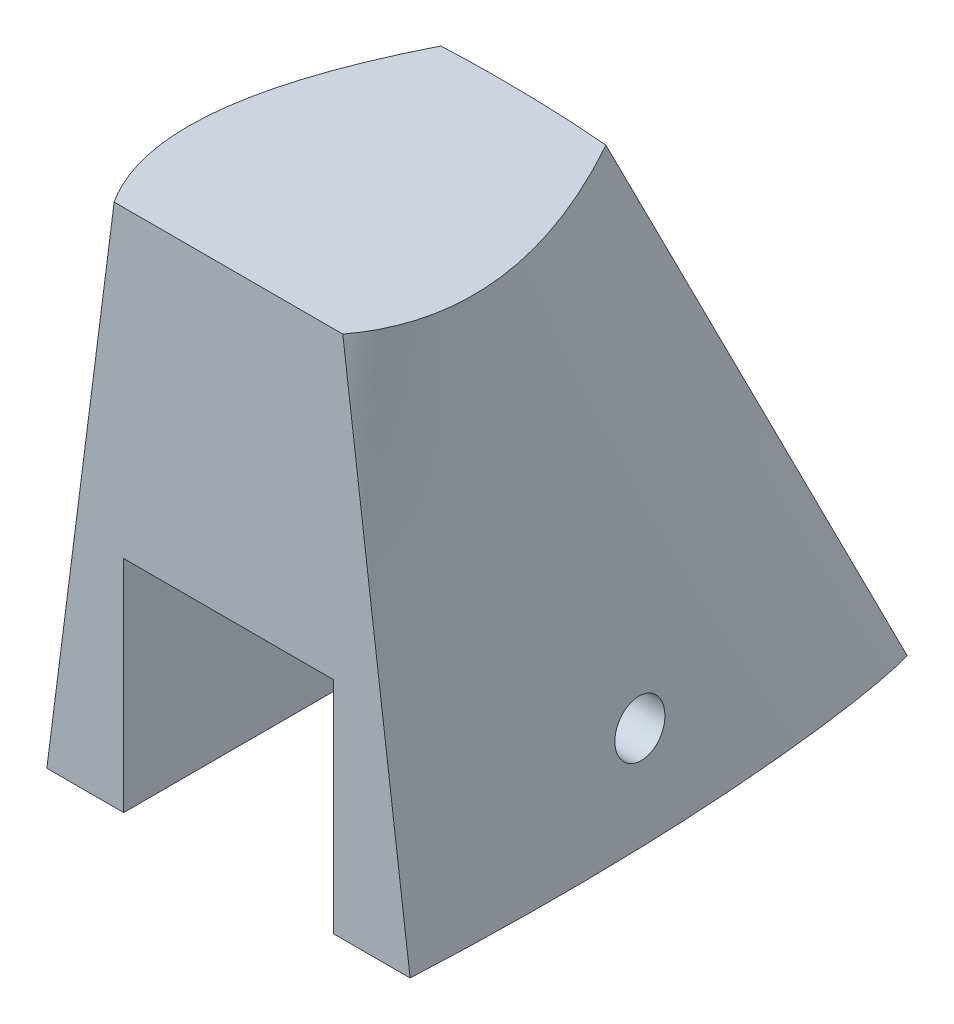
ISO-10303-21;
HEADER;
FILE_DESCRIPTION(('STEP AP214'),'2;1');
FILE_NAME('part.step','',(''),(''),'','','');
FILE_SCHEMA(('AUTOMOTIVE_DESIGN { 1 0 10303 214 1 1 1 1 }'));
ENDSEC;
DATA;
#1=APPLICATION_CONTEXT('core data for automotive mechanical design processes');
#2=APPLICATION_PROTOCOL_DEFINITION('international standard','automotive_design',2000,#1);
#3=PRODUCT_CONTEXT('',#1,'mechanical');
#4=PRODUCT('Part','Part','',(#3));
#5=PRODUCT_RELATED_PRODUCT_CATEGORY('part','',(#4));
#6=PRODUCT_DEFINITION_FORMATION('','',#4);
#7=PRODUCT_DEFINITION_CONTEXT('part definition',#1,'design');
#8=PRODUCT_DEFINITION('design','',#6,#7);
#9=PRODUCT_DEFINITION_SHAPE('','',#8);
#10=(LENGTH_UNIT() NAMED_UNIT(*) SI_UNIT(.MILLI.,.METRE.));
#11=(NAMED_UNIT(*) PLANE_ANGLE_UNIT() SI_UNIT($,.RADIAN.));
#12=(NAMED_UNIT(*) SI_UNIT($,.STERADIAN.) SOLID_ANGLE_UNIT());
#13=UNCERTAINTY_MEASURE_WITH_UNIT(LENGTH_MEASURE(1.E-05),#10,'distance_accuracy_value','');
#14=(GEOMETRIC_REPRESENTATION_CONTEXT(3) GLOBAL_UNCERTAINTY_ASSIGNED_CONTEXT((#13)) GLOBAL_UNIT_ASSIGNED_CONTEXT((#10,
#11,#12)) REPRESENTATION_CONTEXT('',''));
#15=CARTESIAN_POINT('',(0.,0.,0.));
#16=DIRECTION('',(0.,0.,1.));
#17=DIRECTION('',(1.,0.,0.));
#18=AXIS2_PLACEMENT_3D('',#15,#16,#17);
#19=CARTESIAN_POINT('',(6.47919218277337E-13,0.,-8.5150911907011));
#20=DIRECTION('',(0.,-1.,0.));
#21=DIRECTION('',(0.,0.,-1.));
#22=AXIS2_PLACEMENT_3D('',#19,#20,#21);
#23=PLANE('',#22);
#24=CARTESIAN_POINT('',(5.76096322759391,0.,-8.29632819805979));
#25=CARTESIAN_POINT('',(1.91974228306342,0.,-8.58801218824814));
#26=CARTESIAN_POINT('',(-1.91974228306213,0.,-8.58801218824821));
#27=CARTESIAN_POINT('',(-5.76096322759262,0.,-8.29632819805992));
#28=B_SPLINE_CURVE_WITH_KNOTS('',3,(#24,#25,#26,#27),.UNSPECIFIED.,.F.,.F.,(4,4),(0.,1.),.UNSPECIFIED.);
#29=CARTESIAN_POINT('',(-4.,0.,-8.40961910674386));
#30=VERTEX_POINT('',#29);
#31=CARTESIAN_POINT('',(-5.760963227599,0.,-8.29632819803115));
#32=VERTEX_POINT('',#31);
#33=EDGE_CURVE('E149',#30,#32,#28,.T.);
#34=ORIENTED_EDGE('',*,*,#33,.F.);
#35=DIRECTION('',(0.,0.,-1.));
#36=VECTOR('',#35,1.);
#37=CARTESIAN_POINT('',(-4.,0.,17.6214543016305));
#38=LINE('',#37,#36);
#39=CARTESIAN_POINT('',(-4.,0.,11.8461538461538));
#40=VERTEX_POINT('',#39);
#41=EDGE_CURVE('E200',#40,#30,#38,.T.);
#42=ORIENTED_EDGE('',*,*,#41,.F.);
#43=CARTESIAN_POINT('',(-8.75,0.,11.8461538461538));
#44=CARTESIAN_POINT('',(0.,0.,11.8461538461538));
#45=CARTESIAN_POINT('',(8.75,0.,11.8461538461538));
#46=B_SPLINE_CURVE_WITH_KNOTS('',2,(#43,#44,#45),.UNSPECIFIED.,.F.,.F.,(3,3),(0.,1.),.UNSPECIFIED.);
#47=CARTESIAN_POINT('',(-6.93238442967533,0.,11.8461538461538));
#48=VERTEX_POINT('',#47);
#49=EDGE_CURVE('E368',#48,#40,#46,.T.);
#50=ORIENTED_EDGE('',*,*,#49,.F.);
#51=CARTESIAN_POINT('',(-5.760963227599,0.,-8.29632819803115));
#52=CARTESIAN_POINT('',(-5.8067513331507,0.,-8.14627627748472));
#53=CARTESIAN_POINT('',(-5.85036434938431,0.,-7.98043940425513));
#54=CARTESIAN_POINT('',(-5.93440813531999,0.,-7.62940137284435));
#55=CARTESIAN_POINT('',(-5.97481704629437,0.,-7.44399749399642));
#56=CARTESIAN_POINT('',(-6.05293666720244,0.,-7.0594241417336));
#57=CARTESIAN_POINT('',(-6.09058507596302,0.,-6.86032047769378));
#58=CARTESIAN_POINT('',(-6.1620273038029,0.,-6.46034957242623));
#59=CARTESIAN_POINT('',(-6.19607325347414,0.,-6.25821084034677));
#60=CARTESIAN_POINT('',(-6.29404613224256,0.,-5.64700565943598));
#61=CARTESIAN_POINT('',(-6.35384978498306,0.,-5.23323118676896));
#62=CARTESIAN_POINT('',(-6.46476620725011,0.,-4.39764983523415));
#63=CARTESIAN_POINT('',(-6.51584025536789,0.,-3.97576874559321));
#64=CARTESIAN_POINT('',(-6.65762831111588,0.,-2.70126736461715));
#65=CARTESIAN_POINT('',(-6.73616120859031,0.,-1.84760811988885));
#66=CARTESIAN_POINT('',(-6.8669899876044,0.,-0.139756635521907));
#67=CARTESIAN_POINT('',(-6.91926675996085,0.,0.715475761900413));
#68=CARTESIAN_POINT('',(-7.04110628436952,0.,3.28431111618752));
#69=CARTESIAN_POINT('',(-7.07574383746952,0.,5.00262853971937));
#70=CARTESIAN_POINT('',(-7.06348531191426,0.,8.42854205599656));
#71=CARTESIAN_POINT('',(-7.01656336326314,0.,10.1384183782692));
#72=CARTESIAN_POINT('',(-6.93238442967542,0.,11.8461538461538));
#73=B_SPLINE_CURVE_WITH_KNOTS('',3,(#51,#52,#53,#54,#55,#56,#57,#58,#59,#60,#61,#62,#63,#64,#65,
#66,#67,#68,#69,#70,#71,#72),.UNSPECIFIED.,.F.,.F.,(4,2,2,2,2,2,2,2,2,2,4),(0.,0.03125,
0.0625000000000001,0.0937500000000001,0.125,0.1875,0.25,0.375,0.5,0.75,1.),.UNSPECIFIED.);
#74=EDGE_CURVE('E279',#32,#48,#73,.T.);
#75=ORIENTED_EDGE('',*,*,#74,.F.);
#76=EDGE_LOOP('',(#34,#42,#50,#75));
#77=FACE_BOUND('',#76,.T.);
#78=ADVANCED_FACE('F119',(#77),#23,.T.);
#79=CARTESIAN_POINT('',(4.36295557759068,20.,11.8461538461538));
#80=DIRECTION('',(0.,0.,1.));
#81=DIRECTION('',(-1.,0.,0.));
#82=AXIS2_PLACEMENT_3D('',#79,#80,#81);
#83=PLANE('',#82);
#84=ORIENTED_EDGE('',*,*,#49,.T.);
#85=DIRECTION('',(0.,1.,0.));
#86=VECTOR('',#85,1.);
#87=CARTESIAN_POINT('',(-4.,20.,11.8461538461538));
#88=LINE('',#87,#86);
#89=CARTESIAN_POINT('',(-4.,8.39916316297851,11.8461538381802));
#90=VERTEX_POINT('',#89);
#91=EDGE_CURVE('E199',#40,#90,#88,.T.);
#92=ORIENTED_EDGE('',*,*,#91,.T.);
#93=DIRECTION('',(1.,0.,0.));
#94=VECTOR('',#93,1.);
#95=CARTESIAN_POINT('',(-4.,8.39916315723639,11.8461538461538));
#96=LINE('',#95,#94);
#97=CARTESIAN_POINT('',(4.,8.39916316297851,11.8461538381802));
#98=VERTEX_POINT('',#97);
#99=EDGE_CURVE('E205',#98,#90,#96,.F.);
#100=ORIENTED_EDGE('',*,*,#99,.F.);
#101=DIRECTION('',(0.,1.,0.));
#102=VECTOR('',#101,1.);
#103=CARTESIAN_POINT('',(4.,20.,11.8461538461538));
#104=LINE('',#103,#102);
#105=CARTESIAN_POINT('',(4.,0.,11.8461538461538));
#106=VERTEX_POINT('',#105);
#107=EDGE_CURVE('E192',#106,#98,#104,.T.);
#108=ORIENTED_EDGE('',*,*,#107,.F.);
#109=CARTESIAN_POINT('',(6.93238442967326,0.,11.8461538461538));
#110=VERTEX_POINT('',#109);
#111=EDGE_CURVE('E393',#106,#110,#46,.T.);
#112=ORIENTED_EDGE('',*,*,#111,.T.);
#113=CARTESIAN_POINT('',(4.36295557759068,20.,11.8461538461538));
#114=CARTESIAN_POINT('',(5.21943186161821,13.3333333333333,11.8461538461538));
#115=CARTESIAN_POINT('',(6.07590814564573,6.66666666666667,11.8461538461538));
#116=CARTESIAN_POINT('',(6.93238442967325,0.,11.8461538461538));
#117=B_SPLINE_CURVE_WITH_KNOTS('',3,(#113,#114,#115,#116),.UNSPECIFIED.,.F.,.F.,(4,4),(0.,1.),.UNSPECIFIED.);
#118=CARTESIAN_POINT('',(4.36295557759068,20.,11.8461538461538));
#119=VERTEX_POINT('',#118);
#120=EDGE_CURVE('E340',#119,#110,#117,.T.);
#121=ORIENTED_EDGE('',*,*,#120,.F.);
#122=DIRECTION('',(1.,0.,0.));
#123=VECTOR('',#122,1.);
#124=CARTESIAN_POINT('',(-4.36295557759068,20.,11.8461538461538));
#125=LINE('',#124,#123);
#126=CARTESIAN_POINT('',(-4.36295557759068,20.,11.8461538461538));
#127=VERTEX_POINT('',#126);
#128=EDGE_CURVE('E503',#127,#119,#125,.T.);
#129=ORIENTED_EDGE('',*,*,#128,.F.);
#130=CARTESIAN_POINT('',(-4.36295557759068,20.,11.8461538461538));
#131=CARTESIAN_POINT('',(-5.21943186161893,13.3333333333333,11.8461538461538));
#132=CARTESIAN_POINT('',(-6.07590814564718,6.66666666666667,11.8461538461538));
#133=CARTESIAN_POINT('',(-6.93238442967542,0.,11.8461538461538));
#134=B_SPLINE_CURVE_WITH_KNOTS('',3,(#130,#131,#132,#133),.UNSPECIFIED.,.F.,.F.,(4,4),(0.,1.),.UNSPECIFIED.);
#135=EDGE_CURVE('E341',#127,#48,#134,.T.);
#136=ORIENTED_EDGE('',*,*,#135,.T.);
#137=EDGE_LOOP('',(#84,#92,#100,#108,#112,#121,#129,#136));
#138=FACE_BOUND('',#137,.T.);
#139=ADVANCED_FACE('F121',(#138),#83,.T.);
#140=CARTESIAN_POINT('',(-3.28790277497466,20.,0.454259940663015));
#141=CARTESIAN_POINT('',(-4.11225625918065,13.3333333333333,-2.46260277224463));
#142=CARTESIAN_POINT('',(-4.93660974338663,6.66666666666667,-5.37946548515228));
#143=CARTESIAN_POINT('',(-5.76096322759262,0.,-8.29632819805992));
#144=CARTESIAN_POINT('',(-2.75174644561783,20.,0.429746985763324));
#145=CARTESIAN_POINT('',(-3.43471696089855,13.3333333333333,-2.50325174136012));
#146=CARTESIAN_POINT('',(-4.11768747617927,6.66666666666667,-5.43625046848356));
#147=CARTESIAN_POINT('',(-4.80065799146,0.,-8.369249195607));
#148=CARTESIAN_POINT('',(-1.67977358058458,20.,0.398186471137266));
#149=CARTESIAN_POINT('',(-2.07993724255484,13.3333333333333,-2.56075258321769));
#150=CARTESIAN_POINT('',(-2.48010090452511,6.66666666666667,-5.51969163757264));
#151=CARTESIAN_POINT('',(-2.88026456649537,0.,-8.4786306919276));
#152=CARTESIAN_POINT('',(-0.0728336640759535,20.,0.40324188471864));
#153=CARTESIAN_POINT('',(-0.0485557760504196,13.3333333333333,-2.57561255688353));
#154=CARTESIAN_POINT('',(-0.0242778880248858,6.66666666666666,-5.55446699848569));
#155=CARTESIAN_POINT('',(6.48136058711835E-13,0.,-8.53332144008786));
#156=CARTESIAN_POINT('',(1.53308687139141,20.,0.460693483820966));
#157=CARTESIAN_POINT('',(1.98214610309316,13.3333333333333,-2.51908124142853));
#158=CARTESIAN_POINT('',(2.43120533479491,6.66666666666667,-5.49885596667802));
#159=CARTESIAN_POINT('',(2.88026456649666,0.,-8.47863069192752));
#160=CARTESIAN_POINT('',(2.60302097434213,20.,0.533925340236815));
#161=CARTESIAN_POINT('',(3.33556664671519,13.3333333333333,-2.43379950504442));
#162=CARTESIAN_POINT('',(4.06811231908824,6.66666666666667,-5.40152435032565));
#163=CARTESIAN_POINT('',(4.80065799146129,0.,-8.36924919560688));
#164=CARTESIAN_POINT('',(3.13781812897728,20.,0.579273966031729));
#165=CARTESIAN_POINT('',(4.0121998285163,13.3333333333333,-2.37926008866544));
#166=CARTESIAN_POINT('',(4.88658152805533,6.66666666666667,-5.33779414336261));
#167=CARTESIAN_POINT('',(5.76096322759435,0.,-8.29632819805978));
#168=B_SPLINE_SURFACE_WITH_KNOTS('',3,3,((#140,#141,#142,#143),(#144,#145,#146,#147),(#148,#149,
#150,#151),(#152,#153,#154,#155),(#156,#157,#158,#159),(#160,#161,#162,#163),(#164,#165,#166,
#167)),.UNSPECIFIED.,.F.,.F.,.F.,(4,1,1,1,4),(4,4),(0.306645599942551,0.349079262473725,
0.391512925004898,0.433946587536072,0.476380250067246),(0.,1.),.UNSPECIFIED.);
#169=CARTESIAN_POINT('',(-4.,10.0992114455502,-3.90879344125424));
#170=CARTESIAN_POINT('',(-3.51970618654818,10.0817341016703,-3.94382984918015));
#171=CARTESIAN_POINT('',(-3.0387585121383,10.0676883616501,-3.97179298295832));
#172=CARTESIAN_POINT('',(-2.07610995827582,10.0467059284975,-4.0134094818933));
#173=CARTESIAN_POINT('',(-1.5944091094109,10.0397689538099,-4.02706341379165));
#174=CARTESIAN_POINT('',(-0.686664484352067,10.0336266746966,-4.03915646651588));
#175=CARTESIAN_POINT('',(-0.260646587220647,10.0336178041258,-4.03917684959916));
#176=CARTESIAN_POINT('',(0.591198906910872,10.0393480453626,-4.02788924803106));
#177=CARTESIAN_POINT('',(1.01702650518624,10.0450871180549,-4.01658134046969));
#178=CARTESIAN_POINT('',(1.86961590153149,10.0622451949711,-3.98261149137385));
#179=CARTESIAN_POINT('',(2.29637570050429,10.0736841523071,-3.95990966204965));
#180=CARTESIAN_POINT('',(3.14897112183231,10.1019970435484,-3.90325230599396));
#181=CARTESIAN_POINT('',(3.57480673725412,10.1188710180873,-3.86929669512608));
#182=CARTESIAN_POINT('',(4.,10.1383350782267,-3.82977453338038));
#183=B_SPLINE_CURVE_WITH_KNOTS('',3,(#169,#170,#171,#172,#173,#174,#175,#176,#177,#178,#179,
#180,#181,#182),.UNSPECIFIED.,.F.,.F.,(4,2,2,2,2,2,4),(0.,1.44561838737642,2.89117951628545,
4.16904697704582,5.44690574186366,6.72926956269325,8.01164297104486),.UNSPECIFIED.);
#184=CARTESIAN_POINT('',(-4.,10.0992114455502,-3.90879344125426));
#185=VERTEX_POINT('',#184);
#186=CARTESIAN_POINT('',(4.,10.1383350782267,-3.82977453338038));
#187=VERTEX_POINT('',#186);
#188=EDGE_CURVE('E134',#185,#187,#183,.T.);
#189=CARTESIAN_POINT('',(-4.,11.870941103437,-3.12000276674606));
#190=CARTESIAN_POINT('',(-4.,10.9910942838933,-3.51163178627637));
#191=CARTESIAN_POINT('',(-4.,10.1112985835498,-3.90337561897401));
#192=CARTESIAN_POINT('',(-4.,8.35178631425786,-4.68704090131557));
#193=CARTESIAN_POINT('',(-4.,7.47206974530746,-5.07896235095525));
#194=CARTESIAN_POINT('',(-4.,5.49358004695059,-5.96056618828693));
#195=CARTESIAN_POINT('',(-4.,4.39482259825535,-6.45028376387649));
#196=CARTESIAN_POINT('',(-4.,2.19737040983152,-7.42985967906575));
#197=CARTESIAN_POINT('',(-4.,1.09867567010479,-7.91971801866963));
#198=CARTESIAN_POINT('',(-4.,0.,-8.40961910674386));
#199=B_SPLINE_CURVE_WITH_KNOTS('',3,(#189,#190,#191,#192,#193,#194,#195,#196,#197,#198),
.UNSPECIFIED.,.F.,.F.,(4,2,2,2,4),(0.,2.88920980121523,5.778419533721,9.3872726807394,
12.9961259349583),.UNSPECIFIED.);
#200=EDGE_CURVE('E13',#185,#30,#199,.T.);
#201=CARTESIAN_POINT('',(-3.28790277497466,20.,0.454259940663015));
#202=CARTESIAN_POINT('',(-4.11225625918065,13.3333333333333,-2.46260277224463));
#203=CARTESIAN_POINT('',(-4.93660974338663,6.66666666666667,-5.37946548515228));
#204=CARTESIAN_POINT('',(-5.76096322759262,0.,-8.29632819805992));
#205=B_SPLINE_CURVE_WITH_KNOTS('',3,(#201,#202,#203,#204),.UNSPECIFIED.,.F.,.F.,(4,4),(0.,1.),.UNSPECIFIED.);
#206=CARTESIAN_POINT('',(-3.28790277497466,20.,0.454259940663015));
#207=VERTEX_POINT('',#206);
#208=EDGE_CURVE('E312',#207,#32,#205,.T.);
#209=CARTESIAN_POINT('',(3.13781812897728,20.,0.579273966031729));
#210=CARTESIAN_POINT('',(0.998629510436692,20.,0.397879462852074));
#211=CARTESIAN_POINT('',(-1.14327745754734,20.,0.356208121064252));
#212=CARTESIAN_POINT('',(-3.28790277497466,20.,0.454259940663015));
#213=B_SPLINE_CURVE_WITH_KNOTS('',3,(#209,#210,#211,#212),.UNSPECIFIED.,.F.,.F.,(4,4),(0.,1.),.UNSPECIFIED.);
#214=CARTESIAN_POINT('',(3.13781812897728,20.,0.579273966031729));
#215=VERTEX_POINT('',#214);
#216=EDGE_CURVE('E213',#215,#207,#213,.T.);
#217=CARTESIAN_POINT('',(3.13781812897728,20.,0.579273966031729));
#218=CARTESIAN_POINT('',(4.0121998285163,13.3333333333333,-2.37926008866544));
#219=CARTESIAN_POINT('',(4.88658152805533,6.66666666666667,-5.33779414336261));
#220=CARTESIAN_POINT('',(5.76096322759435,0.,-8.29632819805978));
#221=B_SPLINE_CURVE_WITH_KNOTS('',3,(#217,#218,#219,#220),.UNSPECIFIED.,.F.,.F.,(4,4),(0.,1.),.UNSPECIFIED.);
#222=CARTESIAN_POINT('',(5.76096322759435,0.,-8.29632819805978));
#223=VERTEX_POINT('',#222);
#224=EDGE_CURVE('E233',#215,#223,#221,.T.);
#225=CARTESIAN_POINT('',(4.,0.,-8.40961910674382));
#226=VERTEX_POINT('',#225);
#227=EDGE_CURVE('E363',#223,#226,#28,.T.);
#228=CARTESIAN_POINT('',(4.,11.870941103437,-3.04419353905678));
#229=CARTESIAN_POINT('',(4.,10.9939219657173,-3.44211581826744));
#230=CARTESIAN_POINT('',(4.,10.1167411706128,-3.83968158151507));
#231=CARTESIAN_POINT('',(4.,8.36210500938562,-4.63420592503767));
#232=CARTESIAN_POINT('',(4.,7.48464964336292,-5.03116450553363));
#233=CARTESIAN_POINT('',(4.,5.50621414931116,-5.92552342423688));
#234=CARTESIAN_POINT('',(4.,4.40516906548183,-6.42278005097896));
#235=CARTESIAN_POINT('',(4.,2.20278704246485,-7.41664794016988));
#236=CARTESIAN_POINT('',(4.,1.10145010314414,-7.91325920232389));
#237=CARTESIAN_POINT('',(4.,0.,-8.40961910674382));
#238=B_SPLINE_CURVE_WITH_KNOTS('',3,(#228,#229,#230,#231,#232,#233,#234,#235,#236,#237),
.UNSPECIFIED.,.F.,.F.,(4,2,2,2,4),(0.,2.8892111625006,5.7784212732093,9.40279407733556,
13.0271685366118),.UNSPECIFIED.);
#239=EDGE_CURVE('E405',#187,#226,#238,.T.);
#240=ORIENTED_EDGE('',*,*,#188,.F.);
#241=ORIENTED_EDGE('',*,*,#200,.T.);
#242=ORIENTED_EDGE('',*,*,#33,.T.);
#243=ORIENTED_EDGE('',*,*,#208,.F.);
#244=ORIENTED_EDGE('',*,*,#216,.F.);
#245=ORIENTED_EDGE('',*,*,#224,.T.);
#246=ORIENTED_EDGE('',*,*,#227,.T.);
#247=ORIENTED_EDGE('',*,*,#239,.F.);
#248=EDGE_LOOP('',(#240,#241,#242,#243,#244,#245,#246,#247));
#249=FACE_BOUND('',#248,.T.);
#250=ADVANCED_FACE('F249',(#249),#168,.T.);
#251=DIRECTION('',(0.,0.,-1.));
#252=VECTOR('',#251,1.);
#253=CARTESIAN_POINT('',(4.,0.,17.6214543016305));
#254=LINE('',#253,#252);
#255=EDGE_CURVE('E195',#106,#226,#254,.T.);
#256=ORIENTED_EDGE('',*,*,#255,.T.);
#257=ORIENTED_EDGE('',*,*,#227,.F.);
#258=CARTESIAN_POINT('',(6.93238442967326,0.,11.8461538461538));
#259=CARTESIAN_POINT('',(7.01656336326121,0.,10.1384183782672));
#260=CARTESIAN_POINT('',(7.06348531191226,0.,8.42854205598782));
#261=CARTESIAN_POINT('',(7.07574383746749,0.,5.00262853970674));
#262=CARTESIAN_POINT('',(7.04110628436735,0.,3.2843111161729));
#263=CARTESIAN_POINT('',(6.91926675995834,0.,0.715475761882828));
#264=CARTESIAN_POINT('',(6.86698998760174,0.,-0.139756635540479));
#265=CARTESIAN_POINT('',(6.73616120858732,0.,-1.84760811990939));
#266=CARTESIAN_POINT('',(6.65762831111272,0.,-2.70126736463862));
#267=CARTESIAN_POINT('',(6.51584025536438,0.,-3.97576874561626));
#268=CARTESIAN_POINT('',(6.46476620724648,0.,-4.39764983525772));
#269=CARTESIAN_POINT('',(6.35384978497916,0.,-5.23323118679357));
#270=CARTESIAN_POINT('',(6.29404613223853,0.,-5.64700565946111));
#271=CARTESIAN_POINT('',(6.19607325346991,0.,-6.25821084037266));
#272=CARTESIAN_POINT('',(6.16202730379862,0.,-6.46034957245239));
#273=CARTESIAN_POINT('',(6.09058507595862,0.,-6.86032047772042));
#274=CARTESIAN_POINT('',(6.05293666719801,0.,-7.05942414176051));
#275=CARTESIAN_POINT('',(5.97481704628983,0.,-7.44399749402389));
#276=CARTESIAN_POINT('',(5.93440813531541,0.,-7.62940137287206));
#277=CARTESIAN_POINT('',(5.85036434937969,0.,-7.98043940428336));
#278=CARTESIAN_POINT('',(5.80675133314605,0.,-8.14627627751316));
#279=CARTESIAN_POINT('',(5.76096322759435,0.,-8.29632819805978));
#280=B_SPLINE_CURVE_WITH_KNOTS('',3,(#258,#259,#260,#261,#262,#263,#264,#265,#266,#267,#268,
#269,#270,#271,#272,#273,#274,#275,#276,#277,#278,#279),.UNSPECIFIED.,.F.,.F.,(4,2,2,2,2,2,2,2,
2,2,4),(0.,0.25,0.5,0.625,0.75,0.8125,0.875,0.90625,0.9375,0.96875,1.),.UNSPECIFIED.);
#281=EDGE_CURVE('E338',#110,#223,#280,.T.);
#282=ORIENTED_EDGE('',*,*,#281,.F.);
#283=ORIENTED_EDGE('',*,*,#111,.F.);
#284=EDGE_LOOP('',(#256,#257,#282,#283));
#285=FACE_BOUND('',#284,.T.);
#286=ADVANCED_FACE('F253',(#285),#23,.T.);
#287=CARTESIAN_POINT('',(-0.0730035609161646,20.,0.411974582305465));
#288=DIRECTION('',(0.,-1.,0.));
#289=DIRECTION('',(0.,0.,-1.));
#290=AXIS2_PLACEMENT_3D('',#287,#288,#289);
#291=PLANE('',#290);
#292=ORIENTED_EDGE('',*,*,#216,.T.);
#293=CARTESIAN_POINT('',(-3.28790277497466,20.,0.454259940663012));
#294=CARTESIAN_POINT('',(-6.99345477709558,20.,7.80002257925671));
#295=CARTESIAN_POINT('',(-4.36295557759068,20.,11.8461538461538));
#296=B_SPLINE_CURVE_WITH_KNOTS('',2,(#293,#294,#295),.UNSPECIFIED.,.F.,.F.,(3,3),(0.,1.),.UNSPECIFIED.);
#297=EDGE_CURVE('E216',#207,#127,#296,.T.);
#298=ORIENTED_EDGE('',*,*,#297,.T.);
#299=ORIENTED_EDGE('',*,*,#128,.T.);
#300=CARTESIAN_POINT('',(4.36295557759068,20.,11.8461538461538));
#301=CARTESIAN_POINT('',(7.2780963631191,20.,8.01198098265211));
#302=CARTESIAN_POINT('',(3.13781812897728,20.,0.579273966031729));
#303=B_SPLINE_CURVE_WITH_KNOTS('',2,(#300,#301,#302),.UNSPECIFIED.,.F.,.F.,(3,3),(0.,1.),.UNSPECIFIED.);
#304=EDGE_CURVE('E227',#119,#215,#303,.T.);
#305=ORIENTED_EDGE('',*,*,#304,.T.);
#306=EDGE_LOOP('',(#292,#298,#299,#305));
#307=FACE_BOUND('',#306,.T.);
#308=ADVANCED_FACE('F247',(#307),#291,.F.);
#309=CARTESIAN_POINT('',(3.13781812897728,20.,0.579273966031729));
#310=CARTESIAN_POINT('',(4.0121998285163,13.3333333333333,-2.37926008866544));
#311=CARTESIAN_POINT('',(4.88658152805533,6.66666666666667,-5.33779414336261));
#312=CARTESIAN_POINT('',(5.76096322759435,0.,-8.29632819805978));
#313=CARTESIAN_POINT('',(3.31032972206652,20.,0.888970091724244));
#314=CARTESIAN_POINT('',(4.1577329609436,13.3333333333333,-2.07276139117268));
#315=CARTESIAN_POINT('',(5.00513619982068,6.66666666666667,-5.03449287406961));
#316=CARTESIAN_POINT('',(5.85253943869776,0.,-7.99622435696654));
#317=CARTESIAN_POINT('',(3.63697942121462,20.,1.49899116041886));
#318=CARTESIAN_POINT('',(4.43139078472646,13.3333333333333,-1.42564386259212));
#319=CARTESIAN_POINT('',(5.2258021482383,6.66666666666667,-4.35027888560311));
#320=CARTESIAN_POINT('',(6.02021351175014,0.,-7.2749139086141));
#321=CARTESIAN_POINT('',(4.21678487138924,20.,2.68154856704645));
#322=CARTESIAN_POINT('',(4.91326528325782,13.3333333333333,-0.094417159499028));
#323=CARTESIAN_POINT('',(5.60974569512639,6.66666666666667,-2.87038288604451));
#324=CARTESIAN_POINT('',(6.30622610699497,0.,-5.64634861258998));
#325=CARTESIAN_POINT('',(4.80374053137958,20.,4.08946145515283));
#326=CARTESIAN_POINT('',(5.39489503357659,13.3333333333333,1.53564667839408));
#327=CARTESIAN_POINT('',(5.98604953577359,6.66666666666667,-1.01816809836467));
#328=CARTESIAN_POINT('',(6.5772040379706,0.,-3.57198287512342));
#329=CARTESIAN_POINT('',(5.2876054790033,20.,5.66650272859553));
#330=CARTESIAN_POINT('',(5.79699915020992,13.3333333333333,3.45244976487946));
#331=CARTESIAN_POINT('',(6.30639282141655,6.66666666666667,1.23839680116339));
#332=CARTESIAN_POINT('',(6.81578649262318,0.,-0.97565616255268));
#333=CARTESIAN_POINT('',(5.63878295001533,20.,7.61928550347252));
#334=CARTESIAN_POINT('',(6.09998480788522,13.3333333333333,5.87450937191445));
#335=CARTESIAN_POINT('',(6.56118666575512,6.66666666666666,4.12973324035639));
#336=CARTESIAN_POINT('',(7.02238852362502,0.,2.38495710879833));
#337=CARTESIAN_POINT('',(5.52655017786864,20.,9.77912849135638));
#338=CARTESIAN_POINT('',(6.05467567262428,13.3333333333333,8.76976978063207));
#339=CARTESIAN_POINT('',(6.58280116737992,6.66666666666667,7.76041106990777));
#340=CARTESIAN_POINT('',(7.11092666213556,0.,6.75105235918346));
#341=CARTESIAN_POINT('',(4.84881237517875,20.,11.2071250355702));
#342=CARTESIAN_POINT('',(5.57139603787291,13.3333333333333,10.8508894831359));
#343=CARTESIAN_POINT('',(6.29397970056706,6.66666666666667,10.4946539307015));
#344=CARTESIAN_POINT('',(7.01656336326121,0.,10.1384183782672));
#345=CARTESIAN_POINT('',(4.36295557759068,20.,11.8461538461538));
#346=CARTESIAN_POINT('',(5.21943186161821,13.3333333333333,11.8461538461538));
#347=CARTESIAN_POINT('',(6.07590814564573,6.66666666666667,11.8461538461538));
#348=CARTESIAN_POINT('',(6.93238442967325,0.,11.8461538461538));
#349=B_SPLINE_SURFACE_WITH_KNOTS('',3,3,((#309,#310,#311,#312),(#313,#314,#315,#316),(#317,#318,
#319,#320),(#321,#322,#323,#324),(#325,#326,#327,#328),(#329,#330,#331,#332),(#333,#334,#335,
#336),(#337,#338,#339,#340),(#341,#342,#343,#344),(#345,#346,#347,#348)),.UNSPECIFIED.,.F.,.F.,
.F.,(4,1,1,1,1,1,1,4),(4,4),(0.476380250067246,0.49555926374676,0.514738277426274,
0.553096304785302,0.59145433214433,0.629812359503359,0.706528414221415,0.783244468939472),(0.,
1.),.UNSPECIFIED.);
#350=CARTESIAN_POINT('',(6.75128008600133,3.64031282206491,3.84615384615384));
#351=CARTESIAN_POINT('',(6.75579484356591,3.58412274688209,3.84615004840401));
#352=CARTESIAN_POINT('',(6.76015990297487,3.52786272310507,3.8413959206186));
#353=CARTESIAN_POINT('',(6.76638792740604,3.4447036732845,3.82724155222992));
#354=CARTESIAN_POINT('',(6.76841217372899,3.41716750670594,3.82134532523406));
#355=CARTESIAN_POINT('',(6.77234309767159,3.36265504231469,3.80724650425701));
#356=CARTESIAN_POINT('',(6.77424966815762,3.33567926909026,3.79904184534167));
#357=CARTESIAN_POINT('',(6.77976373480945,3.25598292132238,3.7710606321062));
#358=CARTESIAN_POINT('',(6.78317308597671,3.20439318469004,3.74789971384358));
#359=CARTESIAN_POINT('',(6.78933980906946,3.10584220565595,3.69321979089075));
#360=CARTESIAN_POINT('',(6.79209718737824,3.05888091794105,3.6617008680377));
#361=CARTESIAN_POINT('',(6.79685007537952,2.97102425716432,3.59127922490496));
#362=CARTESIAN_POINT('',(6.7988476534047,2.93011260428687,3.5523969881818));
#363=CARTESIAN_POINT('',(6.80200027428539,2.85538785924376,3.4682934405223));
#364=CARTESIAN_POINT('',(6.80315530345292,2.82157488240882,3.42307202661456));
#365=CARTESIAN_POINT('',(6.80455008602721,2.76213423843281,3.32776027981843));
#366=CARTESIAN_POINT('',(6.80479326220439,2.73647629300712,3.27768887995984));
#367=CARTESIAN_POINT('',(6.80433001312344,2.69390652800279,3.17396161734099));
#368=CARTESIAN_POINT('',(6.80362360483153,2.67699455216747,3.12030581863942));
#369=CARTESIAN_POINT('',(6.80124961169903,2.65241615126314,3.01104659412753));
#370=CARTESIAN_POINT('',(6.79958387641266,2.64473202287857,2.95544710888985));
#371=CARTESIAN_POINT('',(6.79531133210103,2.63875372936074,2.8437822941205));
#372=CARTESIAN_POINT('',(6.79270452327518,2.64045956223784,2.78771696468754));
#373=CARTESIAN_POINT('',(6.78659821731193,2.65319998131709,2.67663081706657));
#374=CARTESIAN_POINT('',(6.7830975310959,2.6642470392683,2.62161149589964));
#375=CARTESIAN_POINT('',(6.77529170368512,2.69534823610251,2.51424105687278));
#376=CARTESIAN_POINT('',(6.77098654461566,2.71540257513377,2.46188999833236));
#377=CARTESIAN_POINT('',(6.76166938916141,2.76404041488498,2.36108397721751));
#378=CARTESIAN_POINT('',(6.75665425517577,2.79266244087169,2.31264789523908));
#379=CARTESIAN_POINT('',(6.74608245116755,2.85757357257371,2.22128608700086));
#380=CARTESIAN_POINT('',(6.74052576329508,2.89386293105439,2.17836054247939));
#381=CARTESIAN_POINT('',(6.72901305799409,2.97331288158043,2.09897023057829));
#382=CARTESIAN_POINT('',(6.72305487478275,3.0165128118093,2.06254514214237));
#383=CARTESIAN_POINT('',(6.71096887844273,3.1084046885733,1.99748233938981));
#384=CARTESIAN_POINT('',(6.70484106039213,3.15709679458837,1.96884485128929));
#385=CARTESIAN_POINT('',(6.69260408146824,3.25881585891764,1.92005731351614));
#386=CARTESIAN_POINT('',(6.68649510171215,3.31185986358845,1.89994274765575));
#387=CARTESIAN_POINT('',(6.67454210755163,3.42061025406853,1.86894987795488));
#388=CARTESIAN_POINT('',(6.66869809452494,3.47631665371849,1.85807162213564));
#389=CARTESIAN_POINT('',(6.65749193684744,3.5887935611121,1.84588170027968));
#390=CARTESIAN_POINT('',(6.65212960748861,3.64556365078973,1.84456635161884));
#391=CARTESIAN_POINT('',(6.64208143483812,3.75856939808505,1.85155850312464));
#392=CARTESIAN_POINT('',(6.63739557440441,3.81480506921142,1.85986575940172));
#393=CARTESIAN_POINT('',(6.6288897678923,3.9248401001238,1.88582919323849));
#394=CARTESIAN_POINT('',(6.62506553661927,3.97865040170742,1.90343758002873));
#395=CARTESIAN_POINT('',(6.61837868091726,4.08258383682965,1.94749828063689));
#396=CARTESIAN_POINT('',(6.61551601820384,4.13270711710337,1.97395024226793));
#397=CARTESIAN_POINT('',(6.61084671113181,4.22748747959058,2.0347508989871));
#398=CARTESIAN_POINT('',(6.60903309865988,4.27217903561042,2.06904532584845));
#399=CARTESIAN_POINT('',(6.60645949004097,4.35519563961378,2.14465929353606));
#400=CARTESIAN_POINT('',(6.60569946576727,4.39352085752978,2.18597864679098));
#401=CARTESIAN_POINT('',(6.60521281677956,4.46255745544783,2.27427833989445));
#402=CARTESIAN_POINT('',(6.60548191496333,4.49329978406963,2.32123446576911));
#403=CARTESIAN_POINT('',(6.60698111729979,4.54650614939489,2.41960871873165));
#404=CARTESIAN_POINT('',(6.60821121881515,4.56897020881665,2.47102683357389));
#405=CARTESIAN_POINT('',(6.61153824906541,4.60500039359238,2.57688589485979));
#406=CARTESIAN_POINT('',(6.61363550921784,4.61856311182853,2.63132799013804));
#407=CARTESIAN_POINT('',(6.61858161546034,4.63640973972928,2.74167873986844));
#408=CARTESIAN_POINT('',(6.62143047542776,4.64069347805583,2.79758742138208));
#409=CARTESIAN_POINT('',(6.62776727554527,4.63987755527636,2.90950134985907));
#410=CARTESIAN_POINT('',(6.63125747629195,4.63474410667235,2.96550622144849));
#411=CARTESIAN_POINT('',(6.63874564903928,4.61518987424358,3.07583538707687));
#412=CARTESIAN_POINT('',(6.6427436330018,4.60076887159914,3.130159641488));
#413=CARTESIAN_POINT('',(6.6511480255056,4.56298048970289,3.23582833292131));
#414=CARTESIAN_POINT('',(6.65555608537272,4.53957563777269,3.28715923712074));
#415=CARTESIAN_POINT('',(6.66465844541719,4.48449651025549,3.38514554093237));
#416=CARTESIAN_POINT('',(6.6693527394024,4.45282241350997,3.43180104163074));
#417=CARTESIAN_POINT('',(6.67894440655519,4.38200353066355,3.51926058585975));
#418=CARTESIAN_POINT('',(6.68384237181601,4.34283556921242,3.56004577073065));
#419=CARTESIAN_POINT('',(6.69373948709455,4.25817802288357,3.63445221142791));
#420=CARTESIAN_POINT('',(6.69873863640909,4.21268848192493,3.66807351702109));
#421=CARTESIAN_POINT('',(6.70624655971548,4.14068738270085,3.71242524623856));
#422=CARTESIAN_POINT('',(6.70875517045011,4.11601231329418,3.7262147211323));
#423=CARTESIAN_POINT('',(6.71376116828024,4.06560880869628,3.75164810860325));
#424=CARTESIAN_POINT('',(6.71625856333229,4.03988132318898,3.76329390558525));
#425=CARTESIAN_POINT('',(6.72371678922154,3.96138975706741,3.79487943695009));
#426=CARTESIAN_POINT('',(6.72865190541284,3.907237053678,3.8115161927579));
#427=CARTESIAN_POINT('',(6.73654697008608,3.8173492474687,3.83100346348237));
#428=CARTESIAN_POINT('',(6.73956353471743,3.78219477249319,3.83667605005723));
#429=CARTESIAN_POINT('',(6.74550011855967,3.71147382884311,3.84425244531591));
#430=CARTESIAN_POINT('',(6.74842013771682,3.67590735993919,3.84615625190164));
#431=CARTESIAN_POINT('',(6.75128008600133,3.64031282206491,3.84615384615384));
#432=B_SPLINE_CURVE_WITH_KNOTS('',3,(#350,#351,#352,#353,#354,#355,#356,#357,#358,#359,#360,
#361,#362,#363,#364,#365,#366,#367,#368,#369,#370,#371,#372,#373,#374,#375,#376,#377,#378,#379,
#380,#381,#382,#383,#384,#385,#386,#387,#388,#389,#390,#391,#392,#393,#394,#395,#396,#397,#398,
#399,#400,#401,#402,#403,#404,#405,#406,#407,#408,#409,#410,#411,#412,#413,#414,#415,#416,#417,
#418,#419,#420,#421,#422,#423,#424,#425,#426,#427,#428,#429,#430,#431),.UNSPECIFIED.,.T.,.F.,(4,
2,2,2,2,2,2,2,2,2,2,2,2,2,2,2,2,2,2,2,2,2,2,2,2,2,2,2,2,2,2,2,2,2,2,2,2,2,2,2,4),(0.,
0.168961462401192,0.253578398889871,0.338271268730431,0.507355320822666,0.676437717394656,
0.845056485404874,1.01367799271755,1.18166591784886,1.34965084158168,1.5173129743878,
1.6849750716682,1.85286137372375,2.02075140651825,2.18940800940097,2.35807017317476,
2.52772904424231,2.69739284307568,2.86775622976252,3.03812050219391,3.20841916478352,
3.37871351116579,3.54814124824231,3.71756223882552,3.88584456330242,4.05412239520758,
4.22170161465999,4.38928037421664,4.55692323963028,4.72456920057349,4.89281782762399,
5.0610704188458,5.23003257429993,5.39899107586086,5.56848079672924,5.73796934012954,
5.82301439185195,5.90798432374559,6.07764654543141,6.18467793496208,6.29170938407768),.UNSPECIFIED.);
#433=CARTESIAN_POINT('',(6.75128008600133,3.64031282206491,3.84615384615384));
#434=VERTEX_POINT('',#433);
#435=EDGE_CURVE('E371',#434,#434,#432,.T.);
#436=ORIENTED_EDGE('',*,*,#435,.F.);
#437=EDGE_LOOP('',(#436));
#438=FACE_BOUND('',#437,.T.);
#439=ORIENTED_EDGE('',*,*,#304,.F.);
#440=ORIENTED_EDGE('',*,*,#120,.T.);
#441=ORIENTED_EDGE('',*,*,#281,.T.);
#442=ORIENTED_EDGE('',*,*,#224,.F.);
#443=EDGE_LOOP('',(#439,#440,#441,#442));
#444=FACE_BOUND('',#443,.T.);
#445=ADVANCED_FACE('F235',(#438,#444),#349,.T.);
#446=CARTESIAN_POINT('',(-4.36295557759068,20.,11.8461538461538));
#447=CARTESIAN_POINT('',(-5.21943186161893,13.3333333333333,11.8461538461538));
#448=CARTESIAN_POINT('',(-6.07590814564718,6.66666666666667,11.8461538461538));
#449=CARTESIAN_POINT('',(-6.93238442967542,0.,11.8461538461538));
#450=CARTESIAN_POINT('',(-4.8013721108415,20.,11.1717986350043));
#451=CARTESIAN_POINT('',(-5.53976919498205,13.3333333333333,10.827338549426));
#452=CARTESIAN_POINT('',(-6.27816627912259,6.66666666666667,10.4828784638476));
#453=CARTESIAN_POINT('',(-7.01656336326314,0.,10.1384183782692));
#454=CARTESIAN_POINT('',(-5.41420304394205,20.,9.68560357221792));
#455=CARTESIAN_POINT('',(-5.97975730346101,13.3333333333333,8.70635500618382));
#456=CARTESIAN_POINT('',(-6.54531156297997,6.66666666666667,7.72710644014972));
#457=CARTESIAN_POINT('',(-7.11086582249893,0.,6.74785787411562));
#458=CARTESIAN_POINT('',(-5.52023637681506,20.,7.48414814251653));
#459=CARTESIAN_POINT('',(-6.02100634348084,13.3333333333333,5.78617040436131));
#460=CARTESIAN_POINT('',(-6.52177631014662,6.66666666666667,4.08819266620609));
#461=CARTESIAN_POINT('',(-7.02254627681241,0.,2.39021492805086));
#462=CARTESIAN_POINT('',(-5.20905984301185,20.,5.51675683802438));
#463=CARTESIAN_POINT('',(-5.7446489963886,13.3333333333333,3.35249670869222));
#464=CARTESIAN_POINT('',(-6.28023814976535,6.66666666666667,1.18823657936007));
#465=CARTESIAN_POINT('',(-6.8158273031421,0.,-0.976023549972076));
#466=CARTESIAN_POINT('',(-4.77767584260864,20.,3.93809987928974));
#467=CARTESIAN_POINT('',(-5.37752079117336,13.3333333333333,1.43483532931488));
#468=CARTESIAN_POINT('',(-5.97736573973808,6.66666666666667,-1.06842922065998));
#469=CARTESIAN_POINT('',(-6.5772106883028,0.,-3.57169377063484));
#470=CARTESIAN_POINT('',(-4.25318784223029,20.,2.53662451337295));
#471=CARTESIAN_POINT('',(-4.93751121650399,13.3333333333333,-0.191216914733425));
#472=CARTESIAN_POINT('',(-5.62183459077769,6.66666666666667,-2.9190583428398));
#473=CARTESIAN_POINT('',(-6.30615796505139,0.,-5.64689977094618));
#474=CARTESIAN_POINT('',(-3.73459664190221,20.,1.36388748045676));
#475=CARTESIAN_POINT('',(-4.49646607396131,13.3333333333333,-1.51570923703047));
#476=CARTESIAN_POINT('',(-5.25833550602041,6.66666666666667,-4.3953059545177));
#477=CARTESIAN_POINT('',(-6.02020493807951,0.,-7.27490267200494));
#478=CARTESIAN_POINT('',(-3.44230077506303,20.,0.760333383937749));
#479=CARTESIAN_POINT('',(-4.24571366294282,13.3333333333333,-2.15851919635426));
#480=CARTESIAN_POINT('',(-5.04912655082261,6.66666666666667,-5.07737177664628));
#481=CARTESIAN_POINT('',(-5.8525394387024,0.,-7.99622435693829));
#482=CARTESIAN_POINT('',(-3.28790277497466,20.,0.454259940663015));
#483=CARTESIAN_POINT('',(-4.11225625918065,13.3333333333333,-2.46260277224463));
#484=CARTESIAN_POINT('',(-4.93660974338663,6.66666666666667,-5.37946548515228));
#485=CARTESIAN_POINT('',(-5.76096322759262,0.,-8.29632819805992));
#486=B_SPLINE_SURFACE_WITH_KNOTS('',3,3,((#446,#447,#448,#449),(#450,#451,#452,#453),(#454,#455,
#456,#457),(#458,#459,#460,#461),(#462,#463,#464,#465),(#466,#467,#468,#469),(#470,#471,#472,
#473),(#474,#475,#476,#477),(#478,#479,#480,#481),(#482,#483,#484,#485)),.UNSPECIFIED.,.F.,.F.,
.F.,(4,1,1,1,1,1,1,4),(4,4),(0.,0.0766613999856378,0.153322799971276,0.191653499964094,
0.229984199956913,0.268314899949732,0.287480249946142,0.306645599942551),(0.,1.),.UNSPECIFIED.);
#487=CARTESIAN_POINT('',(-6.63651727682798,3.64031282206491,1.84615384615385));
#488=CARTESIAN_POINT('',(-6.64197351755772,3.58379206991568,1.84615769449673));
#489=CARTESIAN_POINT('',(-6.64772929554698,3.52723922008106,1.85096806063057));
#490=CARTESIAN_POINT('',(-6.65664383245914,3.44371127947036,1.86526069190462));
#491=CARTESIAN_POINT('',(-6.65966487929687,3.41606227436556,1.87121259910071));
#492=CARTESIAN_POINT('',(-6.66577830825535,3.36134725229472,1.885436668025));
#493=CARTESIAN_POINT('',(-6.66887075076992,3.33428176937046,1.89371086550834));
#494=CARTESIAN_POINT('',(-6.67820141595645,3.25436512478682,1.92190982140051));
#495=CARTESIAN_POINT('',(-6.68450552942545,3.20267665530099,1.94523111735118));
#496=CARTESIAN_POINT('',(-6.69705368260955,3.10399274334136,2.00024823993747));
#497=CARTESIAN_POINT('',(-6.70329772124011,3.05699738545085,2.0319442174713));
#498=CARTESIAN_POINT('',(-6.71552411771691,2.96893519359925,2.10288303726596));
#499=CARTESIAN_POINT('',(-6.72150609398823,2.92787681643865,2.14213646269771));
#500=CARTESIAN_POINT('',(-6.73299871931448,2.85295755629219,2.2270589357083));
#501=CARTESIAN_POINT('',(-6.73850935324099,2.81909690427604,2.27272818908827));
#502=CARTESIAN_POINT('',(-6.74886754854559,2.75965210047798,2.36904824046786));
#503=CARTESIAN_POINT('',(-6.75371702974546,2.73404367763698,2.41968384789374));
#504=CARTESIAN_POINT('',(-6.76262538888503,2.6917291042967,2.52461257470026));
#505=CARTESIAN_POINT('',(-6.76668429394424,2.6750226483949,2.57890556853383));
#506=CARTESIAN_POINT('',(-6.77387598662062,2.65109498855897,2.68925761349262));
#507=CARTESIAN_POINT('',(-6.77701421487421,2.64381715650021,2.74530403084474));
#508=CARTESIAN_POINT('',(-6.7823205181019,2.63879577380526,2.85786783579966));
#509=CARTESIAN_POINT('',(-6.78448862774695,2.64105188240669,2.91438520649757));
#510=CARTESIAN_POINT('',(-6.78780504837839,2.6550120186675,3.02594423635492));
#511=CARTESIAN_POINT('',(-6.78895908163395,2.66666231163241,3.08099245396982));
#512=CARTESIAN_POINT('',(-6.79026417738871,2.69902042558014,3.18837126963152));
#513=CARTESIAN_POINT('',(-6.79041525778556,2.71972808492759,3.24070191615674));
#514=CARTESIAN_POINT('',(-6.78974470154032,2.76954480437591,3.34101868864473));
#515=CARTESIAN_POINT('',(-6.78892562335532,2.79863161455969,3.3890158839905));
#516=CARTESIAN_POINT('',(-6.78637777537903,2.86439716318567,3.47946372511473));
#517=CARTESIAN_POINT('',(-6.78464900422601,2.9010759129923,3.52191436259036));
#518=CARTESIAN_POINT('',(-6.78036281402375,2.98102436384802,3.60012295492531));
#519=CARTESIAN_POINT('',(-6.77780445045609,3.02430154753518,3.63587320761504));
#520=CARTESIAN_POINT('',(-6.7719623496699,3.11618437292588,3.69962692945321));
#521=CARTESIAN_POINT('',(-6.76867859946255,3.16479011003506,3.72763025986442));
#522=CARTESIAN_POINT('',(-6.76148742187282,3.26614570670724,3.77520974112828));
#523=CARTESIAN_POINT('',(-6.75757769964181,3.31891043732461,3.79475386400657));
#524=CARTESIAN_POINT('',(-6.7492661539056,3.42693054314047,3.82472931681217));
#525=CARTESIAN_POINT('',(-6.74486431918651,3.48218597507812,3.83516043903132));
#526=CARTESIAN_POINT('',(-6.73567173197009,3.5938741190058,3.84665799549682));
#527=CARTESIAN_POINT('',(-6.73087938085054,3.65031088693547,3.8476837622083));
#528=CARTESIAN_POINT('',(-6.72104282981628,3.76253380988712,3.84024867491256));
#529=CARTESIAN_POINT('',(-6.71599862527206,3.81831995292625,3.8317876464606));
#530=CARTESIAN_POINT('',(-6.70575539723138,3.92784323439335,3.80558426772891));
#531=CARTESIAN_POINT('',(-6.70055593203366,3.98157328529349,3.78781245938327));
#532=CARTESIAN_POINT('',(-6.69012420056625,4.08527205741706,3.74347826317921));
#533=CARTESIAN_POINT('',(-6.68489193398534,4.13524074289375,3.71691579179025));
#534=CARTESIAN_POINT('',(-6.67448786948703,4.23006071879182,3.65571281516696));
#535=CARTESIAN_POINT('',(-6.66931616061605,4.27490515933722,3.62106168123679));
#536=CARTESIAN_POINT('',(-6.65913758402378,4.35811963978778,3.54468298819897));
#537=CARTESIAN_POINT('',(-6.65413071653209,4.39648967067558,3.50295541923566));
#538=CARTESIAN_POINT('',(-6.64438244979981,4.4656370924132,3.41362928892084));
#539=CARTESIAN_POINT('',(-6.63964091889684,4.49641827521041,3.36603367758306));
#540=CARTESIAN_POINT('',(-6.63052348000391,4.54952363857944,3.26630511425003));
#541=CARTESIAN_POINT('',(-6.62614756899926,4.57184788888738,3.21417219967389));
#542=CARTESIAN_POINT('',(-6.61788025863943,4.60734891607528,3.10696580467502));
#543=CARTESIAN_POINT('',(-6.61398785565953,4.62054491002503,3.05189876628543));
#544=CARTESIAN_POINT('',(-6.60679342117403,4.63747071057373,2.94029037087177));
#545=CARTESIAN_POINT('',(-6.60349138092751,4.6412006573379,2.88374903569037));
#546=CARTESIAN_POINT('',(-6.59760845428033,4.63907248191728,2.77100956244836));
#547=CARTESIAN_POINT('',(-6.59502506139385,4.6332481859815,2.71481091761548));
#548=CARTESIAN_POINT('',(-6.59068002117427,4.61222387257586,2.60416238339621));
#549=CARTESIAN_POINT('',(-6.5889183549304,4.59702407088736,2.54971245379273));
#550=CARTESIAN_POINT('',(-6.58632601552022,4.55775637123385,2.44435183666276));
#551=CARTESIAN_POINT('',(-6.58549140644047,4.53372654540035,2.39342705387965));
#552=CARTESIAN_POINT('',(-6.58481942940599,4.47746938348902,2.29632067033548));
#553=CARTESIAN_POINT('',(-6.58498199798514,4.44524256923983,2.25013876790044));
#554=CARTESIAN_POINT('',(-6.58634734300557,4.37363868976135,2.16397892145961));
#555=CARTESIAN_POINT('',(-6.58754677201913,4.33428495614391,2.1239815006832));
#556=CARTESIAN_POINT('',(-6.59098746116466,4.24945300371151,2.05112538333576));
#557=CARTESIAN_POINT('',(-6.59322871279083,4.20397483490069,2.01826662848544));
#558=CARTESIAN_POINT('',(-6.59733709588696,4.13217969353301,1.9750326295784));
#559=CARTESIAN_POINT('',(-6.59883297075112,4.10762354447182,1.96161924964547));
#560=CARTESIAN_POINT('',(-6.60206232224295,4.05751226695792,1.93690981531332));
#561=CARTESIAN_POINT('',(-6.60379558776315,4.03195804035232,1.92561190056448));
#562=CARTESIAN_POINT('',(-6.60933449391339,3.95406604134214,1.89501724806299));
#563=CARTESIAN_POINT('',(-6.61348374641258,3.90042034574004,1.87897239054842));
#564=CARTESIAN_POINT('',(-6.62082906448075,3.81209188119379,1.86041032609798));
#565=CARTESIAN_POINT('',(-6.62378860365517,3.77794552936218,1.85506974133404));
#566=CARTESIAN_POINT('',(-6.62996731272072,3.70930771277814,1.84794032725301));
#567=CARTESIAN_POINT('',(-6.63318648253689,3.67481624812537,1.84615149691028));
#568=CARTESIAN_POINT('',(-6.63651727682798,3.64031282206491,1.84615384615385));
#569=B_SPLINE_CURVE_WITH_KNOTS('',3,(#487,#488,#489,#490,#491,#492,#493,#494,#495,#496,#497,
#498,#499,#500,#501,#502,#503,#504,#505,#506,#507,#508,#509,#510,#511,#512,#513,#514,#515,#516,
#517,#518,#519,#520,#521,#522,#523,#524,#525,#526,#527,#528,#529,#530,#531,#532,#533,#534,#535,
#536,#537,#538,#539,#540,#541,#542,#543,#544,#545,#546,#547,#548,#549,#550,#551,#552,#553,#554,
#555,#556,#557,#558,#559,#560,#561,#562,#563,#564,#565,#566,#567,#568),.UNSPECIFIED.,.T.,.F.,(4,
2,2,2,2,2,2,2,2,2,2,2,2,2,2,2,2,2,2,2,2,2,2,2,2,2,2,2,2,2,2,2,2,2,2,2,2,2,2,2,4),(0.,
0.170201311645723,0.255448913724927,0.340771479820396,0.511062689605543,0.681356967971823,
0.851891477877818,1.02243145928485,1.19246517907375,1.36249306508808,1.53149495920831,
1.70049081290881,1.86852681071194,2.03655980991112,2.20415066512635,2.37174177121162,
2.53952435923463,2.70730995182958,2.87572536695614,3.04414462059262,3.2132917555842,
3.38244200093182,3.55213067609878,3.72182096372594,3.89173549625922,4.06165026544197,
4.23147995983103,4.40130825376851,4.57077792317059,4.74024508319444,4.90911354837177,
5.07797812711281,5.24612300114958,5.41425717359,5.58185055583137,5.74944256980716,
5.83341798645931,5.9173192043077,6.0848495932087,6.1887500164034,6.29265040959448),.UNSPECIFIED.);
#570=CARTESIAN_POINT('',(-6.63651727682798,3.64031282206491,1.84615384615385));
#571=VERTEX_POINT('',#570);
#572=EDGE_CURVE('E124',#571,#571,#569,.T.);
#573=ORIENTED_EDGE('',*,*,#572,.F.);
#574=EDGE_LOOP('',(#573));
#575=FACE_BOUND('',#574,.T.);
#576=ORIENTED_EDGE('',*,*,#297,.F.);
#577=ORIENTED_EDGE('',*,*,#208,.T.);
#578=ORIENTED_EDGE('',*,*,#74,.T.);
#579=ORIENTED_EDGE('',*,*,#135,.F.);
#580=EDGE_LOOP('',(#576,#577,#578,#579));
#581=FACE_BOUND('',#580,.T.);
#582=ADVANCED_FACE('F246',(#575,#581),#486,.T.);
#583=CARTESIAN_POINT('',(-4.,2.92574029488755,-12.5859435548409));
#584=CARTESIAN_POINT('',(-4.,20.5173325316538,2.6649299469343));
#585=CARTESIAN_POINT('',(-4.,2.92574029488754,17.6214543016305));
#586=B_SPLINE_CURVE_WITH_KNOTS('',2,(#583,#584,#585),.UNSPECIFIED.,.F.,.F.,(3,3),(0.,1.),.UNSPECIFIED.);
#587=DIRECTION('',(1.,0.,0.));
#588=VECTOR('',#587,1.);
#589=SURFACE_OF_LINEAR_EXTRUSION('',#586,#588);
#590=ORIENTED_EDGE('',*,*,#99,.T.);
#591=EDGE_CURVE('E466',#185,#90,#586,.T.);
#592=ORIENTED_EDGE('',*,*,#591,.F.);
#593=ORIENTED_EDGE('',*,*,#188,.T.);
#594=CARTESIAN_POINT('',(4.,2.92574029488755,-12.5859435548409));
#595=CARTESIAN_POINT('',(4.,20.5173325316538,2.6649299469343));
#596=CARTESIAN_POINT('',(4.,2.92574029488754,17.6214543016305));
#597=B_SPLINE_CURVE_WITH_KNOTS('',2,(#594,#595,#596),.UNSPECIFIED.,.F.,.F.,(3,3),(0.,1.),.UNSPECIFIED.);
#598=EDGE_CURVE('E142',#187,#98,#597,.T.);
#599=ORIENTED_EDGE('',*,*,#598,.T.);
#600=EDGE_LOOP('',(#590,#592,#593,#599));
#601=FACE_BOUND('',#600,.T.);
#602=ADVANCED_FACE('F203',(#601),#589,.F.);
#603=CARTESIAN_POINT('',(-4.,11.7215364132707,2.59134266016455));
#604=DIRECTION('',(1.,0.,0.));
#605=DIRECTION('',(0.,0.,-1.));
#606=AXIS2_PLACEMENT_3D('',#603,#604,#605);
#607=PLANE('',#606);
#608=CARTESIAN_POINT('',(-4.,3.64031282206491,2.84615384615385));
#609=DIRECTION('',(1.,0.,0.));
#610=DIRECTION('',(0.,0.,-1.));
#611=AXIS2_PLACEMENT_3D('',#608,#609,#610);
#612=CIRCLE('',#611,0.999999999999993);
#613=CARTESIAN_POINT('',(-4.,3.64031282206491,1.84615384615385));
#614=VERTEX_POINT('',#613);
#615=EDGE_CURVE('E685',#614,#614,#612,.T.);
#616=ORIENTED_EDGE('',*,*,#615,.F.);
#617=EDGE_LOOP('',(#616));
#618=FACE_BOUND('',#617,.T.);
#619=ORIENTED_EDGE('',*,*,#41,.T.);
#620=ORIENTED_EDGE('',*,*,#200,.F.);
#621=ORIENTED_EDGE('',*,*,#591,.T.);
#622=ORIENTED_EDGE('',*,*,#91,.F.);
#623=EDGE_LOOP('',(#619,#620,#621,#622));
#624=FACE_BOUND('',#623,.T.);
#625=ADVANCED_FACE('F460',(#618,#624),#607,.T.);
#626=CARTESIAN_POINT('',(4.,11.7215364132707,2.59134266016455));
#627=DIRECTION('',(1.,0.,0.));
#628=DIRECTION('',(0.,0.,-1.));
#629=AXIS2_PLACEMENT_3D('',#626,#627,#628);
#630=PLANE('',#629);
#631=CARTESIAN_POINT('',(4.,3.64031282206491,2.84615384615385));
#632=DIRECTION('',(1.,0.,0.));
#633=DIRECTION('',(0.,0.,-1.));
#634=AXIS2_PLACEMENT_3D('',#631,#632,#633);
#635=CIRCLE('',#634,0.999999999999993);
#636=CARTESIAN_POINT('',(4.,3.64031282206491,1.84615384615385));
#637=VERTEX_POINT('',#636);
#638=EDGE_CURVE('E209',#637,#637,#635,.T.);
#639=ORIENTED_EDGE('',*,*,#638,.T.);
#640=EDGE_LOOP('',(#639));
#641=FACE_BOUND('',#640,.T.);
#642=ORIENTED_EDGE('',*,*,#107,.T.);
#643=ORIENTED_EDGE('',*,*,#598,.F.);
#644=ORIENTED_EDGE('',*,*,#239,.T.);
#645=ORIENTED_EDGE('',*,*,#255,.F.);
#646=EDGE_LOOP('',(#642,#643,#644,#645));
#647=FACE_BOUND('',#646,.T.);
#648=ADVANCED_FACE('F193',(#641,#647),#630,.F.);
#649=CARTESIAN_POINT('',(0.,3.64031282206491,2.84615384615385));
#650=DIRECTION('',(-1.,0.,0.));
#651=DIRECTION('',(0.,0.,1.));
#652=AXIS2_PLACEMENT_3D('',#649,#650,#651);
#653=CYLINDRICAL_SURFACE('',#652,0.999999999999993);
#654=ORIENTED_EDGE('',*,*,#435,.T.);
#655=EDGE_LOOP('',(#654));
#656=FACE_BOUND('',#655,.T.);
#657=ORIENTED_EDGE('',*,*,#638,.F.);
#658=EDGE_LOOP('',(#657));
#659=FACE_BOUND('',#658,.T.);
#660=ADVANCED_FACE('F459',(#656,#659),#653,.F.);
#661=CARTESIAN_POINT('',(0.,3.64031282206491,2.84615384615385));
#662=DIRECTION('',(1.,0.,0.));
#663=DIRECTION('',(0.,0.,-1.));
#664=AXIS2_PLACEMENT_3D('',#661,#662,#663);
#665=CYLINDRICAL_SURFACE('',#664,0.999999999999993);
#666=ORIENTED_EDGE('',*,*,#615,.T.);
#667=EDGE_LOOP('',(#666));
#668=FACE_BOUND('',#667,.T.);
#669=ORIENTED_EDGE('',*,*,#572,.T.);
#670=EDGE_LOOP('',(#669));
#671=FACE_BOUND('',#670,.T.);
#672=ADVANCED_FACE('F625',(#668,#671),#665,.F.);
#673=CLOSED_SHELL('',(#78,#139,#250,#286,#308,#445,#582,#602,#625,#648,#660,#672));
#674=MANIFOLD_SOLID_BREP('B2',#673);
#675=ADVANCED_BREP_SHAPE_REPRESENTATION('',(#18,#674),#14);
#676=SHAPE_DEFINITION_REPRESENTATION(#9,#675);
ENDSEC;
END-ISO-10303-21;
